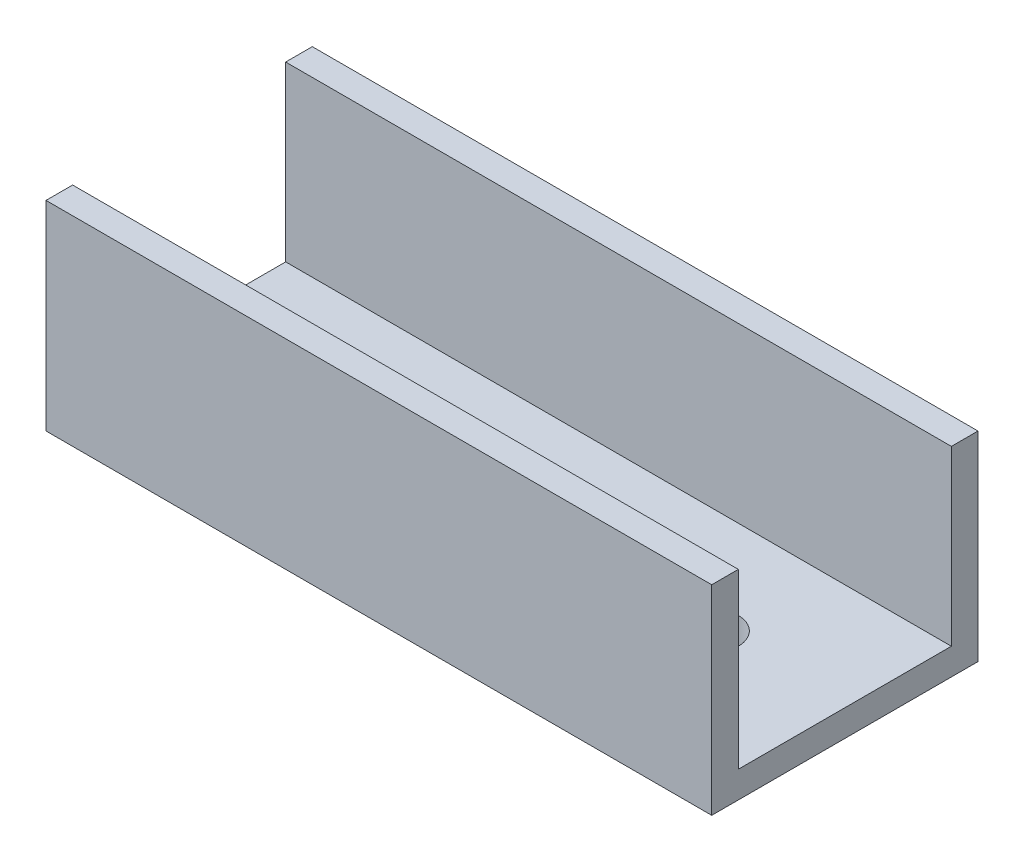
ISO-10303-21;
HEADER;
FILE_DESCRIPTION(('STEP AP214'),'2;1');
FILE_NAME('part.step','',(''),(''),'','','');
FILE_SCHEMA(('AUTOMOTIVE_DESIGN { 1 0 10303 214 1 1 1 1 }'));
ENDSEC;
DATA;
#1=APPLICATION_CONTEXT('core data for automotive mechanical design processes');
#2=APPLICATION_PROTOCOL_DEFINITION('international standard','automotive_design',2000,#1);
#3=PRODUCT_CONTEXT('',#1,'mechanical');
#4=PRODUCT('Part','Part','',(#3));
#5=PRODUCT_RELATED_PRODUCT_CATEGORY('part','',(#4));
#6=PRODUCT_DEFINITION_FORMATION('','',#4);
#7=PRODUCT_DEFINITION_CONTEXT('part definition',#1,'design');
#8=PRODUCT_DEFINITION('design','',#6,#7);
#9=PRODUCT_DEFINITION_SHAPE('','',#8);
#10=(LENGTH_UNIT() NAMED_UNIT(*) SI_UNIT(.MILLI.,.METRE.));
#11=(NAMED_UNIT(*) PLANE_ANGLE_UNIT() SI_UNIT($,.RADIAN.));
#12=(NAMED_UNIT(*) SI_UNIT($,.STERADIAN.) SOLID_ANGLE_UNIT());
#13=UNCERTAINTY_MEASURE_WITH_UNIT(LENGTH_MEASURE(1.E-05),#10,'distance_accuracy_value','');
#14=(GEOMETRIC_REPRESENTATION_CONTEXT(3) GLOBAL_UNCERTAINTY_ASSIGNED_CONTEXT((#13)) GLOBAL_UNIT_ASSIGNED_CONTEXT((#10,
#11,#12)) REPRESENTATION_CONTEXT('',''));
#15=CARTESIAN_POINT('',(0.,0.,0.));
#16=DIRECTION('',(0.,0.,1.));
#17=DIRECTION('',(1.,0.,0.));
#18=AXIS2_PLACEMENT_3D('',#15,#16,#17);
#19=CARTESIAN_POINT('',(50.,30.,-20.));
#20=DIRECTION('',(0.,0.,1.));
#21=DIRECTION('',(1.,0.,0.));
#22=AXIS2_PLACEMENT_3D('',#19,#20,#21);
#23=PLANE('',#22);
#24=DIRECTION('',(0.,1.,0.));
#25=VECTOR('',#24,1.);
#26=CARTESIAN_POINT('',(-50.,30.,-20.));
#27=LINE('',#26,#25);
#28=CARTESIAN_POINT('',(-50.,0.,-20.));
#29=VERTEX_POINT('',#28);
#30=CARTESIAN_POINT('',(-50.,30.,-20.));
#31=VERTEX_POINT('',#30);
#32=EDGE_CURVE('E155',#29,#31,#27,.T.);
#33=ORIENTED_EDGE('',*,*,#32,.T.);
#34=DIRECTION('',(-1.,0.,0.));
#35=VECTOR('',#34,1.);
#36=CARTESIAN_POINT('',(50.,30.,-20.));
#37=LINE('',#36,#35);
#38=CARTESIAN_POINT('',(50.,30.,-20.));
#39=VERTEX_POINT('',#38);
#40=EDGE_CURVE('E11',#39,#31,#37,.T.);
#41=ORIENTED_EDGE('',*,*,#40,.F.);
#42=DIRECTION('',(0.,1.,0.));
#43=VECTOR('',#42,1.);
#44=CARTESIAN_POINT('',(50.,30.,-20.));
#45=LINE('',#44,#43);
#46=CARTESIAN_POINT('',(50.,0.,-20.));
#47=VERTEX_POINT('',#46);
#48=EDGE_CURVE('E177',#47,#39,#45,.T.);
#49=ORIENTED_EDGE('',*,*,#48,.F.);
#50=DIRECTION('',(-1.,0.,0.));
#51=VECTOR('',#50,1.);
#52=CARTESIAN_POINT('',(50.,0.,-20.));
#53=LINE('',#52,#51);
#54=EDGE_CURVE('E151',#47,#29,#53,.T.);
#55=ORIENTED_EDGE('',*,*,#54,.T.);
#56=EDGE_LOOP('',(#33,#41,#49,#55));
#57=FACE_BOUND('',#56,.T.);
#58=ADVANCED_FACE('F51',(#57),#23,.F.);
#59=CARTESIAN_POINT('',(50.,30.,-16.));
#60=DIRECTION('',(0.,-1.,0.));
#61=DIRECTION('',(0.,0.,-1.));
#62=AXIS2_PLACEMENT_3D('',#59,#60,#61);
#63=PLANE('',#62);
#64=DIRECTION('',(0.,0.,1.));
#65=VECTOR('',#64,1.);
#66=CARTESIAN_POINT('',(-50.,30.,-16.));
#67=LINE('',#66,#65);
#68=CARTESIAN_POINT('',(-50.,30.,-16.));
#69=VERTEX_POINT('',#68);
#70=EDGE_CURVE('E159',#31,#69,#67,.T.);
#71=ORIENTED_EDGE('',*,*,#70,.T.);
#72=DIRECTION('',(-1.,0.,0.));
#73=VECTOR('',#72,1.);
#74=CARTESIAN_POINT('',(50.,30.,-16.));
#75=LINE('',#74,#73);
#76=CARTESIAN_POINT('',(50.,30.,-16.));
#77=VERTEX_POINT('',#76);
#78=EDGE_CURVE('E61',#77,#69,#75,.T.);
#79=ORIENTED_EDGE('',*,*,#78,.F.);
#80=DIRECTION('',(0.,0.,1.));
#81=VECTOR('',#80,1.);
#82=CARTESIAN_POINT('',(50.,30.,-16.));
#83=LINE('',#82,#81);
#84=EDGE_CURVE('E112',#39,#77,#83,.T.);
#85=ORIENTED_EDGE('',*,*,#84,.F.);
#86=ORIENTED_EDGE('',*,*,#40,.T.);
#87=EDGE_LOOP('',(#71,#79,#85,#86));
#88=FACE_BOUND('',#87,.T.);
#89=ADVANCED_FACE('F275',(#88),#63,.F.);
#90=CARTESIAN_POINT('',(50.,4.,-16.));
#91=DIRECTION('',(0.,0.,-1.));
#92=DIRECTION('',(-1.,0.,0.));
#93=AXIS2_PLACEMENT_3D('',#90,#91,#92);
#94=PLANE('',#93);
#95=DIRECTION('',(0.,-1.,0.));
#96=VECTOR('',#95,1.);
#97=CARTESIAN_POINT('',(-50.,4.,-16.));
#98=LINE('',#97,#96);
#99=CARTESIAN_POINT('',(-50.,4.,-16.));
#100=VERTEX_POINT('',#99);
#101=EDGE_CURVE('E163',#69,#100,#98,.T.);
#102=ORIENTED_EDGE('',*,*,#101,.T.);
#103=DIRECTION('',(-1.,0.,0.));
#104=VECTOR('',#103,1.);
#105=CARTESIAN_POINT('',(50.,4.,-16.));
#106=LINE('',#105,#104);
#107=CARTESIAN_POINT('',(50.,4.,-16.));
#108=VERTEX_POINT('',#107);
#109=EDGE_CURVE('E188',#108,#100,#106,.T.);
#110=ORIENTED_EDGE('',*,*,#109,.F.);
#111=DIRECTION('',(0.,-1.,0.));
#112=VECTOR('',#111,1.);
#113=CARTESIAN_POINT('',(50.,4.,-16.));
#114=LINE('',#113,#112);
#115=EDGE_CURVE('E199',#77,#108,#114,.T.);
#116=ORIENTED_EDGE('',*,*,#115,.F.);
#117=ORIENTED_EDGE('',*,*,#78,.T.);
#118=EDGE_LOOP('',(#102,#110,#116,#117));
#119=FACE_BOUND('',#118,.T.);
#120=ADVANCED_FACE('F197',(#119),#94,.F.);
#121=CARTESIAN_POINT('',(50.,4.,16.));
#122=DIRECTION('',(0.,-1.,0.));
#123=DIRECTION('',(0.,0.,-1.));
#124=AXIS2_PLACEMENT_3D('',#121,#122,#123);
#125=PLANE('',#124);
#126=CARTESIAN_POINT('',(-30.,4.,0.));
#127=DIRECTION('',(0.,-1.,0.));
#128=DIRECTION('',(0.,0.,-1.));
#129=AXIS2_PLACEMENT_3D('',#126,#127,#128);
#130=CIRCLE('',#129,4.);
#131=CARTESIAN_POINT('',(-30.,4.,-4.));
#132=VERTEX_POINT('',#131);
#133=EDGE_CURVE('E160',#132,#132,#130,.F.);
#134=ORIENTED_EDGE('',*,*,#133,.F.);
#135=EDGE_LOOP('',(#134));
#136=FACE_BOUND('',#135,.T.);
#137=CARTESIAN_POINT('',(0.,4.,0.));
#138=DIRECTION('',(0.,-1.,0.));
#139=DIRECTION('',(0.,0.,-1.));
#140=AXIS2_PLACEMENT_3D('',#137,#138,#139);
#141=CIRCLE('',#140,4.);
#142=CARTESIAN_POINT('',(0.,4.,-4.));
#143=VERTEX_POINT('',#142);
#144=EDGE_CURVE('E224',#143,#143,#141,.F.);
#145=ORIENTED_EDGE('',*,*,#144,.F.);
#146=EDGE_LOOP('',(#145));
#147=FACE_BOUND('',#146,.T.);
#148=CARTESIAN_POINT('',(30.,4.,0.));
#149=DIRECTION('',(0.,-1.,0.));
#150=DIRECTION('',(0.,0.,-1.));
#151=AXIS2_PLACEMENT_3D('',#148,#149,#150);
#152=CIRCLE('',#151,4.);
#153=CARTESIAN_POINT('',(30.,4.,-4.));
#154=VERTEX_POINT('',#153);
#155=EDGE_CURVE('E228',#154,#154,#152,.F.);
#156=ORIENTED_EDGE('',*,*,#155,.F.);
#157=EDGE_LOOP('',(#156));
#158=FACE_BOUND('',#157,.T.);
#159=DIRECTION('',(0.,0.,1.));
#160=VECTOR('',#159,1.);
#161=CARTESIAN_POINT('',(-50.,4.,16.));
#162=LINE('',#161,#160);
#163=CARTESIAN_POINT('',(-50.,4.,16.));
#164=VERTEX_POINT('',#163);
#165=EDGE_CURVE('E166',#100,#164,#162,.T.);
#166=ORIENTED_EDGE('',*,*,#165,.T.);
#167=DIRECTION('',(-1.,0.,0.));
#168=VECTOR('',#167,1.);
#169=CARTESIAN_POINT('',(50.,4.,16.));
#170=LINE('',#169,#168);
#171=CARTESIAN_POINT('',(50.,4.,16.));
#172=VERTEX_POINT('',#171);
#173=EDGE_CURVE('E184',#172,#164,#170,.T.);
#174=ORIENTED_EDGE('',*,*,#173,.F.);
#175=DIRECTION('',(0.,0.,1.));
#176=VECTOR('',#175,1.);
#177=CARTESIAN_POINT('',(50.,4.,16.));
#178=LINE('',#177,#176);
#179=EDGE_CURVE('E212',#108,#172,#178,.T.);
#180=ORIENTED_EDGE('',*,*,#179,.F.);
#181=ORIENTED_EDGE('',*,*,#109,.T.);
#182=EDGE_LOOP('',(#166,#174,#180,#181));
#183=FACE_BOUND('',#182,.T.);
#184=ADVANCED_FACE('F207',(#136,#147,#158,#183),#125,.F.);
#185=CARTESIAN_POINT('',(50.,30.,16.));
#186=DIRECTION('',(0.,0.,1.));
#187=DIRECTION('',(1.,0.,0.));
#188=AXIS2_PLACEMENT_3D('',#185,#186,#187);
#189=PLANE('',#188);
#190=DIRECTION('',(0.,1.,0.));
#191=VECTOR('',#190,1.);
#192=CARTESIAN_POINT('',(-50.,30.,16.));
#193=LINE('',#192,#191);
#194=CARTESIAN_POINT('',(-50.,30.,16.));
#195=VERTEX_POINT('',#194);
#196=EDGE_CURVE('E169',#164,#195,#193,.T.);
#197=ORIENTED_EDGE('',*,*,#196,.T.);
#198=DIRECTION('',(-1.,0.,0.));
#199=VECTOR('',#198,1.);
#200=CARTESIAN_POINT('',(50.,30.,16.));
#201=LINE('',#200,#199);
#202=CARTESIAN_POINT('',(50.,30.,16.));
#203=VERTEX_POINT('',#202);
#204=EDGE_CURVE('E142',#203,#195,#201,.T.);
#205=ORIENTED_EDGE('',*,*,#204,.F.);
#206=DIRECTION('',(0.,1.,0.));
#207=VECTOR('',#206,1.);
#208=CARTESIAN_POINT('',(50.,30.,16.));
#209=LINE('',#208,#207);
#210=EDGE_CURVE('E131',#172,#203,#209,.T.);
#211=ORIENTED_EDGE('',*,*,#210,.F.);
#212=ORIENTED_EDGE('',*,*,#173,.T.);
#213=EDGE_LOOP('',(#197,#205,#211,#212));
#214=FACE_BOUND('',#213,.T.);
#215=ADVANCED_FACE('F210',(#214),#189,.F.);
#216=CARTESIAN_POINT('',(50.,30.,20.));
#217=DIRECTION('',(0.,-1.,0.));
#218=DIRECTION('',(0.,0.,-1.));
#219=AXIS2_PLACEMENT_3D('',#216,#217,#218);
#220=PLANE('',#219);
#221=DIRECTION('',(0.,0.,1.));
#222=VECTOR('',#221,1.);
#223=CARTESIAN_POINT('',(-50.,30.,20.));
#224=LINE('',#223,#222);
#225=CARTESIAN_POINT('',(-50.,30.,20.));
#226=VERTEX_POINT('',#225);
#227=EDGE_CURVE('E140',#195,#226,#224,.T.);
#228=ORIENTED_EDGE('',*,*,#227,.T.);
#229=DIRECTION('',(-1.,0.,0.));
#230=VECTOR('',#229,1.);
#231=CARTESIAN_POINT('',(50.,30.,20.));
#232=LINE('',#231,#230);
#233=CARTESIAN_POINT('',(50.,30.,20.));
#234=VERTEX_POINT('',#233);
#235=EDGE_CURVE('E137',#234,#226,#232,.T.);
#236=ORIENTED_EDGE('',*,*,#235,.F.);
#237=DIRECTION('',(0.,0.,1.));
#238=VECTOR('',#237,1.);
#239=CARTESIAN_POINT('',(50.,30.,20.));
#240=LINE('',#239,#238);
#241=EDGE_CURVE('E125',#203,#234,#240,.T.);
#242=ORIENTED_EDGE('',*,*,#241,.F.);
#243=ORIENTED_EDGE('',*,*,#204,.T.);
#244=EDGE_LOOP('',(#228,#236,#242,#243));
#245=FACE_BOUND('',#244,.T.);
#246=ADVANCED_FACE('F138',(#245),#220,.F.);
#247=CARTESIAN_POINT('',(50.,0.,20.));
#248=DIRECTION('',(0.,0.,-1.));
#249=DIRECTION('',(-1.,0.,0.));
#250=AXIS2_PLACEMENT_3D('',#247,#248,#249);
#251=PLANE('',#250);
#252=DIRECTION('',(0.,-1.,0.));
#253=VECTOR('',#252,1.);
#254=CARTESIAN_POINT('',(-50.,0.,20.));
#255=LINE('',#254,#253);
#256=CARTESIAN_POINT('',(-50.,0.,20.));
#257=VERTEX_POINT('',#256);
#258=EDGE_CURVE('E98',#226,#257,#255,.T.);
#259=ORIENTED_EDGE('',*,*,#258,.T.);
#260=DIRECTION('',(-1.,0.,0.));
#261=VECTOR('',#260,1.);
#262=CARTESIAN_POINT('',(50.,0.,20.));
#263=LINE('',#262,#261);
#264=CARTESIAN_POINT('',(50.,0.,20.));
#265=VERTEX_POINT('',#264);
#266=EDGE_CURVE('E143',#265,#257,#263,.T.);
#267=ORIENTED_EDGE('',*,*,#266,.F.);
#268=DIRECTION('',(0.,-1.,0.));
#269=VECTOR('',#268,1.);
#270=CARTESIAN_POINT('',(50.,0.,20.));
#271=LINE('',#270,#269);
#272=EDGE_CURVE('E129',#234,#265,#271,.T.);
#273=ORIENTED_EDGE('',*,*,#272,.F.);
#274=ORIENTED_EDGE('',*,*,#235,.T.);
#275=EDGE_LOOP('',(#259,#267,#273,#274));
#276=FACE_BOUND('',#275,.T.);
#277=ADVANCED_FACE('F145',(#276),#251,.F.);
#278=CARTESIAN_POINT('',(50.,0.,-20.));
#279=DIRECTION('',(0.,1.,0.));
#280=DIRECTION('',(0.,0.,1.));
#281=AXIS2_PLACEMENT_3D('',#278,#279,#280);
#282=PLANE('',#281);
#283=CARTESIAN_POINT('',(-30.,0.,0.));
#284=DIRECTION('',(0.,1.,0.));
#285=DIRECTION('',(0.,0.,1.));
#286=AXIS2_PLACEMENT_3D('',#283,#284,#285);
#287=CIRCLE('',#286,4.);
#288=CARTESIAN_POINT('',(-30.,0.,4.));
#289=VERTEX_POINT('',#288);
#290=EDGE_CURVE('E232',#289,#289,#287,.T.);
#291=ORIENTED_EDGE('',*,*,#290,.T.);
#292=EDGE_LOOP('',(#291));
#293=FACE_BOUND('',#292,.T.);
#294=CARTESIAN_POINT('',(0.,0.,0.));
#295=DIRECTION('',(0.,1.,0.));
#296=DIRECTION('',(0.,0.,1.));
#297=AXIS2_PLACEMENT_3D('',#294,#295,#296);
#298=CIRCLE('',#297,4.);
#299=CARTESIAN_POINT('',(0.,0.,4.));
#300=VERTEX_POINT('',#299);
#301=EDGE_CURVE('E237',#300,#300,#298,.T.);
#302=ORIENTED_EDGE('',*,*,#301,.T.);
#303=EDGE_LOOP('',(#302));
#304=FACE_BOUND('',#303,.T.);
#305=CARTESIAN_POINT('',(30.,0.,0.));
#306=DIRECTION('',(0.,1.,0.));
#307=DIRECTION('',(0.,0.,1.));
#308=AXIS2_PLACEMENT_3D('',#305,#306,#307);
#309=CIRCLE('',#308,4.);
#310=CARTESIAN_POINT('',(30.,0.,4.));
#311=VERTEX_POINT('',#310);
#312=EDGE_CURVE('E233',#311,#311,#309,.T.);
#313=ORIENTED_EDGE('',*,*,#312,.T.);
#314=EDGE_LOOP('',(#313));
#315=FACE_BOUND('',#314,.T.);
#316=DIRECTION('',(0.,0.,-1.));
#317=VECTOR('',#316,1.);
#318=CARTESIAN_POINT('',(-50.,0.,-20.));
#319=LINE('',#318,#317);
#320=EDGE_CURVE('E104',#257,#29,#319,.T.);
#321=ORIENTED_EDGE('',*,*,#320,.T.);
#322=ORIENTED_EDGE('',*,*,#54,.F.);
#323=DIRECTION('',(0.,0.,-1.));
#324=VECTOR('',#323,1.);
#325=CARTESIAN_POINT('',(50.,0.,-20.));
#326=LINE('',#325,#324);
#327=EDGE_CURVE('E69',#265,#47,#326,.T.);
#328=ORIENTED_EDGE('',*,*,#327,.F.);
#329=ORIENTED_EDGE('',*,*,#266,.T.);
#330=EDGE_LOOP('',(#321,#322,#328,#329));
#331=FACE_BOUND('',#330,.T.);
#332=ADVANCED_FACE('F244',(#293,#304,#315,#331),#282,.F.);
#333=CARTESIAN_POINT('',(50.,0.,0.));
#334=DIRECTION('',(-1.,0.,0.));
#335=DIRECTION('',(0.,0.,1.));
#336=AXIS2_PLACEMENT_3D('',#333,#334,#335);
#337=PLANE('',#336);
#338=ORIENTED_EDGE('',*,*,#48,.T.);
#339=ORIENTED_EDGE('',*,*,#84,.T.);
#340=ORIENTED_EDGE('',*,*,#115,.T.);
#341=ORIENTED_EDGE('',*,*,#179,.T.);
#342=ORIENTED_EDGE('',*,*,#210,.T.);
#343=ORIENTED_EDGE('',*,*,#241,.T.);
#344=ORIENTED_EDGE('',*,*,#272,.T.);
#345=ORIENTED_EDGE('',*,*,#327,.T.);
#346=EDGE_LOOP('',(#338,#339,#340,#341,#342,#343,#344,#345));
#347=FACE_BOUND('',#346,.T.);
#348=ADVANCED_FACE('F127',(#347),#337,.F.);
#349=CARTESIAN_POINT('',(-50.,0.,0.));
#350=DIRECTION('',(-1.,0.,0.));
#351=DIRECTION('',(0.,0.,1.));
#352=AXIS2_PLACEMENT_3D('',#349,#350,#351);
#353=PLANE('',#352);
#354=ORIENTED_EDGE('',*,*,#32,.F.);
#355=ORIENTED_EDGE('',*,*,#320,.F.);
#356=ORIENTED_EDGE('',*,*,#258,.F.);
#357=ORIENTED_EDGE('',*,*,#227,.F.);
#358=ORIENTED_EDGE('',*,*,#196,.F.);
#359=ORIENTED_EDGE('',*,*,#165,.F.);
#360=ORIENTED_EDGE('',*,*,#101,.F.);
#361=ORIENTED_EDGE('',*,*,#70,.F.);
#362=EDGE_LOOP('',(#354,#355,#356,#357,#358,#359,#360,#361));
#363=FACE_BOUND('',#362,.T.);
#364=ADVANCED_FACE('F203',(#363),#353,.T.);
#365=CARTESIAN_POINT('',(30.,30.,0.));
#366=DIRECTION('',(0.,-1.,0.));
#367=DIRECTION('',(0.,0.,-1.));
#368=AXIS2_PLACEMENT_3D('',#365,#366,#367);
#369=CYLINDRICAL_SURFACE('',#368,4.);
#370=ORIENTED_EDGE('',*,*,#312,.F.);
#371=EDGE_LOOP('',(#370));
#372=FACE_BOUND('',#371,.T.);
#373=ORIENTED_EDGE('',*,*,#155,.T.);
#374=EDGE_LOOP('',(#373));
#375=FACE_BOUND('',#374,.T.);
#376=ADVANCED_FACE('F261',(#372,#375),#369,.F.);
#377=CARTESIAN_POINT('',(0.,30.,0.));
#378=DIRECTION('',(0.,-1.,0.));
#379=DIRECTION('',(0.,0.,-1.));
#380=AXIS2_PLACEMENT_3D('',#377,#378,#379);
#381=CYLINDRICAL_SURFACE('',#380,4.);
#382=ORIENTED_EDGE('',*,*,#301,.F.);
#383=EDGE_LOOP('',(#382));
#384=FACE_BOUND('',#383,.T.);
#385=ORIENTED_EDGE('',*,*,#144,.T.);
#386=EDGE_LOOP('',(#385));
#387=FACE_BOUND('',#386,.T.);
#388=ADVANCED_FACE('F250',(#384,#387),#381,.F.);
#389=CARTESIAN_POINT('',(-30.,30.,0.));
#390=DIRECTION('',(0.,-1.,0.));
#391=DIRECTION('',(0.,0.,-1.));
#392=AXIS2_PLACEMENT_3D('',#389,#390,#391);
#393=CYLINDRICAL_SURFACE('',#392,4.);
#394=ORIENTED_EDGE('',*,*,#290,.F.);
#395=EDGE_LOOP('',(#394));
#396=FACE_BOUND('',#395,.T.);
#397=ORIENTED_EDGE('',*,*,#133,.T.);
#398=EDGE_LOOP('',(#397));
#399=FACE_BOUND('',#398,.T.);
#400=ADVANCED_FACE('F247',(#396,#399),#393,.F.);
#401=CLOSED_SHELL('',(#58,#89,#120,#184,#215,#246,#277,#332,#348,#364,#376,#388,#400));
#402=MANIFOLD_SOLID_BREP('B2',#401);
#403=ADVANCED_BREP_SHAPE_REPRESENTATION('',(#18,#402),#14);
#404=SHAPE_DEFINITION_REPRESENTATION(#9,#403);
ENDSEC;
END-ISO-10303-21;
